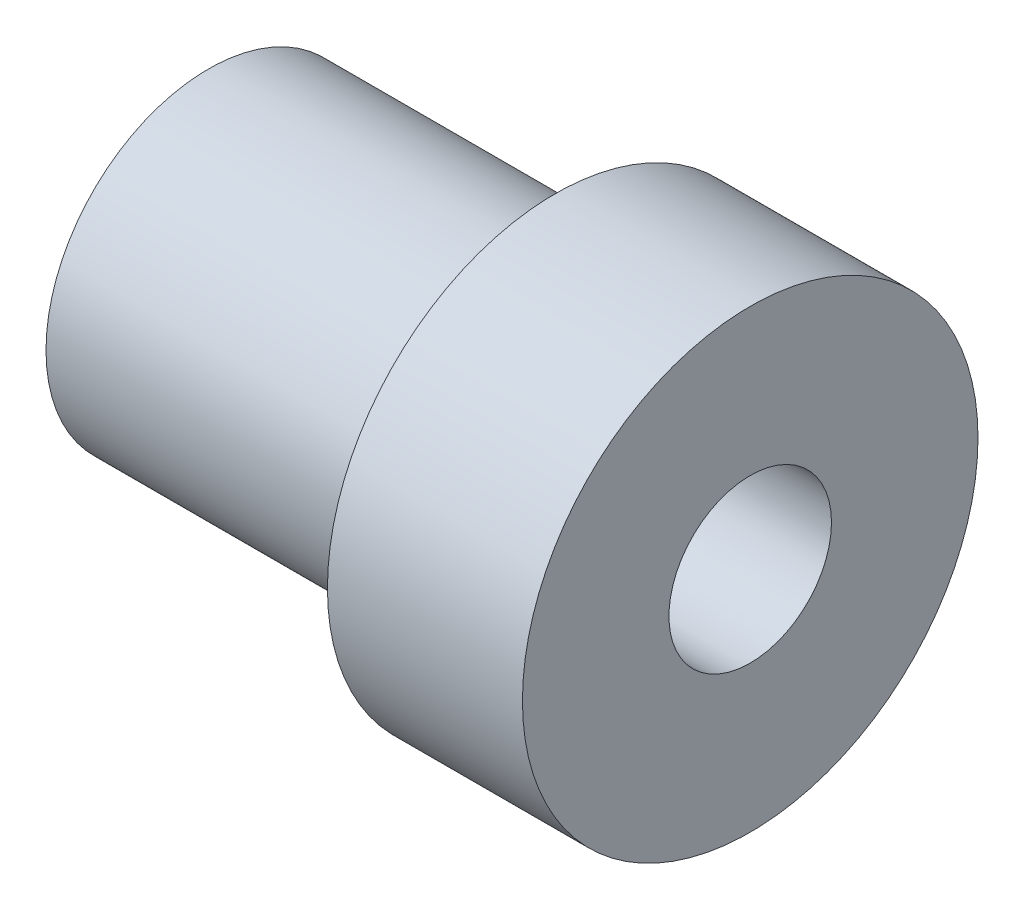
ISO-10303-21;
HEADER;
FILE_DESCRIPTION(('STEP AP214'),'2;1');
FILE_NAME('part.step','',(''),(''),'','','');
FILE_SCHEMA(('AUTOMOTIVE_DESIGN { 1 0 10303 214 1 1 1 1 }'));
ENDSEC;
DATA;
#1=APPLICATION_CONTEXT('core data for automotive mechanical design processes');
#2=APPLICATION_PROTOCOL_DEFINITION('international standard','automotive_design',2000,#1);
#3=PRODUCT_CONTEXT('',#1,'mechanical');
#4=PRODUCT('Part','Part','',(#3));
#5=PRODUCT_RELATED_PRODUCT_CATEGORY('part','',(#4));
#6=PRODUCT_DEFINITION_FORMATION('','',#4);
#7=PRODUCT_DEFINITION_CONTEXT('part definition',#1,'design');
#8=PRODUCT_DEFINITION('design','',#6,#7);
#9=PRODUCT_DEFINITION_SHAPE('','',#8);
#10=(LENGTH_UNIT() NAMED_UNIT(*) SI_UNIT(.MILLI.,.METRE.));
#11=(NAMED_UNIT(*) PLANE_ANGLE_UNIT() SI_UNIT($,.RADIAN.));
#12=(NAMED_UNIT(*) SI_UNIT($,.STERADIAN.) SOLID_ANGLE_UNIT());
#13=UNCERTAINTY_MEASURE_WITH_UNIT(LENGTH_MEASURE(1.E-05),#10,'distance_accuracy_value','');
#14=(GEOMETRIC_REPRESENTATION_CONTEXT(3) GLOBAL_UNCERTAINTY_ASSIGNED_CONTEXT((#13)) GLOBAL_UNIT_ASSIGNED_CONTEXT((#10,
#11,#12)) REPRESENTATION_CONTEXT('',''));
#15=CARTESIAN_POINT('',(0.,0.,0.));
#16=DIRECTION('',(0.,0.,1.));
#17=DIRECTION('',(1.,0.,0.));
#18=AXIS2_PLACEMENT_3D('',#15,#16,#17);
#19=CARTESIAN_POINT('',(8.46666666666667,0.,0.));
#20=DIRECTION('',(-1.,0.,0.));
#21=DIRECTION('',(0.,0.,1.));
#22=AXIS2_PLACEMENT_3D('',#19,#20,#21);
#23=CYLINDRICAL_SURFACE('',#22,3.96875);
#24=CARTESIAN_POINT('',(8.46666666666667,0.,0.));
#25=DIRECTION('',(1.,0.,0.));
#26=DIRECTION('',(0.,0.,-1.));
#27=AXIS2_PLACEMENT_3D('',#24,#25,#26);
#28=CIRCLE('',#27,3.96875);
#29=CARTESIAN_POINT('',(8.46666666666667,0.,-3.96875));
#30=VERTEX_POINT('',#29);
#31=EDGE_CURVE('E10',#30,#30,#28,.T.);
#32=ORIENTED_EDGE('',*,*,#31,.F.);
#33=EDGE_LOOP('',(#32));
#34=FACE_BOUND('',#33,.T.);
#35=CARTESIAN_POINT('',(0.,0.,0.));
#36=DIRECTION('',(1.,0.,0.));
#37=DIRECTION('',(0.,0.,-1.));
#38=AXIS2_PLACEMENT_3D('',#35,#36,#37);
#39=CIRCLE('',#38,3.96875);
#40=CARTESIAN_POINT('',(0.,0.,-3.96875));
#41=VERTEX_POINT('',#40);
#42=EDGE_CURVE('E34',#41,#41,#39,.T.);
#43=ORIENTED_EDGE('',*,*,#42,.T.);
#44=EDGE_LOOP('',(#43));
#45=FACE_BOUND('',#44,.T.);
#46=ADVANCED_FACE('F31',(#34,#45),#23,.T.);
#47=CARTESIAN_POINT('',(0.,0.,0.));
#48=DIRECTION('',(1.,0.,0.));
#49=DIRECTION('',(0.,0.,-1.));
#50=AXIS2_PLACEMENT_3D('',#47,#48,#49);
#51=PLANE('',#50);
#52=CARTESIAN_POINT('',(0.,0.,0.));
#53=DIRECTION('',(1.,0.,0.));
#54=DIRECTION('',(0.,0.,-1.));
#55=AXIS2_PLACEMENT_3D('',#52,#53,#54);
#56=CIRCLE('',#55,1.98437499999999);
#57=CARTESIAN_POINT('',(0.,0.,-1.98437499999999));
#58=VERTEX_POINT('',#57);
#59=EDGE_CURVE('E46',#58,#58,#56,.T.);
#60=ORIENTED_EDGE('',*,*,#59,.T.);
#61=EDGE_LOOP('',(#60));
#62=FACE_BOUND('',#61,.T.);
#63=ORIENTED_EDGE('',*,*,#42,.F.);
#64=EDGE_LOOP('',(#63));
#65=FACE_BOUND('',#64,.T.);
#66=ADVANCED_FACE('F72',(#62,#65),#51,.F.);
#67=CARTESIAN_POINT('',(8.46666666666667,0.,0.));
#68=DIRECTION('',(1.,0.,0.));
#69=DIRECTION('',(0.,0.,-1.));
#70=AXIS2_PLACEMENT_3D('',#67,#68,#69);
#71=PLANE('',#70);
#72=CARTESIAN_POINT('',(8.46666666666667,0.,0.));
#73=DIRECTION('',(1.,0.,0.));
#74=DIRECTION('',(0.,0.,-1.));
#75=AXIS2_PLACEMENT_3D('',#72,#73,#74);
#76=CIRCLE('',#75,5.5626);
#77=CARTESIAN_POINT('',(8.46666666666666,0.,5.5626));
#78=VERTEX_POINT('',#77);
#79=EDGE_CURVE('E43',#78,#78,#76,.T.);
#80=ORIENTED_EDGE('',*,*,#79,.F.);
#81=EDGE_LOOP('',(#80));
#82=FACE_BOUND('',#81,.T.);
#83=ORIENTED_EDGE('',*,*,#31,.T.);
#84=EDGE_LOOP('',(#83));
#85=FACE_BOUND('',#84,.T.);
#86=ADVANCED_FACE('F67',(#82,#85),#71,.F.);
#87=CARTESIAN_POINT('',(13.2291666666667,0.,0.));
#88=DIRECTION('',(-1.,0.,0.));
#89=DIRECTION('',(0.,0.,1.));
#90=AXIS2_PLACEMENT_3D('',#87,#88,#89);
#91=CYLINDRICAL_SURFACE('',#90,5.5626);
#92=CARTESIAN_POINT('',(13.2291666666667,0.,0.));
#93=DIRECTION('',(1.,0.,0.));
#94=DIRECTION('',(0.,0.,-1.));
#95=AXIS2_PLACEMENT_3D('',#92,#93,#94);
#96=CIRCLE('',#95,5.5626);
#97=CARTESIAN_POINT('',(13.2291666666667,0.,5.5626));
#98=VERTEX_POINT('',#97);
#99=EDGE_CURVE('E41',#98,#98,#96,.T.);
#100=CARTESIAN_POINT('',(13.2291666666667,0.,5.5626));
#101=CARTESIAN_POINT('',(13.1795572916667,0.,5.5626));
#102=CARTESIAN_POINT('',(13.1299479166667,0.,5.5626));
#103=CARTESIAN_POINT('',(13.0307291666667,0.,5.5626));
#104=CARTESIAN_POINT('',(12.9811197916667,0.,5.5626));
#105=CARTESIAN_POINT('',(12.8819010416667,0.,5.5626));
#106=CARTESIAN_POINT('',(12.8322916666667,0.,5.5626));
#107=CARTESIAN_POINT('',(12.7330729166667,0.,5.5626));
#108=CARTESIAN_POINT('',(12.6834635416667,0.,5.5626));
#109=CARTESIAN_POINT('',(12.5842447916667,0.,5.5626));
#110=CARTESIAN_POINT('',(12.5346354166667,0.,5.5626));
#111=CARTESIAN_POINT('',(12.4354166666667,0.,5.5626));
#112=CARTESIAN_POINT('',(12.3858072916667,0.,5.5626));
#113=CARTESIAN_POINT('',(12.2865885416667,0.,5.5626));
#114=CARTESIAN_POINT('',(12.2369791666667,0.,5.5626));
#115=CARTESIAN_POINT('',(12.1377604166667,0.,5.5626));
#116=CARTESIAN_POINT('',(12.0881510416667,0.,5.5626));
#117=CARTESIAN_POINT('',(11.9889322916667,0.,5.5626));
#118=CARTESIAN_POINT('',(11.9393229166667,0.,5.5626));
#119=CARTESIAN_POINT('',(11.8401041666667,0.,5.5626));
#120=CARTESIAN_POINT('',(11.7904947916667,0.,5.5626));
#121=CARTESIAN_POINT('',(11.6912760416667,0.,5.5626));
#122=CARTESIAN_POINT('',(11.6416666666667,0.,5.5626));
#123=CARTESIAN_POINT('',(11.5424479166667,0.,5.5626));
#124=CARTESIAN_POINT('',(11.4928385416667,0.,5.5626));
#125=CARTESIAN_POINT('',(11.3936197916667,0.,5.5626));
#126=CARTESIAN_POINT('',(11.3440104166667,0.,5.5626));
#127=CARTESIAN_POINT('',(11.2447916666667,0.,5.5626));
#128=CARTESIAN_POINT('',(11.1951822916667,0.,5.5626));
#129=CARTESIAN_POINT('',(11.0959635416667,0.,5.5626));
#130=CARTESIAN_POINT('',(11.0463541666667,0.,5.5626));
#131=CARTESIAN_POINT('',(10.9471354166667,0.,5.5626));
#132=CARTESIAN_POINT('',(10.8975260416667,0.,5.5626));
#133=CARTESIAN_POINT('',(10.7983072916667,0.,5.5626));
#134=CARTESIAN_POINT('',(10.7486979166667,0.,5.5626));
#135=CARTESIAN_POINT('',(10.6494791666667,0.,5.5626));
#136=CARTESIAN_POINT('',(10.5998697916667,0.,5.5626));
#137=CARTESIAN_POINT('',(10.5006510416667,0.,5.5626));
#138=CARTESIAN_POINT('',(10.4510416666667,0.,5.5626));
#139=CARTESIAN_POINT('',(10.3518229166667,0.,5.5626));
#140=CARTESIAN_POINT('',(10.3022135416667,0.,5.5626));
#141=CARTESIAN_POINT('',(10.2029947916667,0.,5.5626));
#142=CARTESIAN_POINT('',(10.1533854166667,0.,5.5626));
#143=CARTESIAN_POINT('',(10.0541666666667,0.,5.5626));
#144=CARTESIAN_POINT('',(10.0045572916667,0.,5.5626));
#145=CARTESIAN_POINT('',(9.90533854166666,0.,5.5626));
#146=CARTESIAN_POINT('',(9.85572916666666,0.,5.5626));
#147=CARTESIAN_POINT('',(9.75651041666666,0.,5.5626));
#148=CARTESIAN_POINT('',(9.70690104166667,0.,5.5626));
#149=CARTESIAN_POINT('',(9.60768229166666,0.,5.5626));
#150=CARTESIAN_POINT('',(9.55807291666667,0.,5.5626));
#151=CARTESIAN_POINT('',(9.45885416666666,0.,5.5626));
#152=CARTESIAN_POINT('',(9.40924479166667,0.,5.5626));
#153=CARTESIAN_POINT('',(9.31002604166666,0.,5.5626));
#154=CARTESIAN_POINT('',(9.26041666666666,0.,5.5626));
#155=CARTESIAN_POINT('',(9.16119791666666,0.,5.5626));
#156=CARTESIAN_POINT('',(9.11158854166666,0.,5.5626));
#157=CARTESIAN_POINT('',(9.01236979166666,0.,5.5626));
#158=CARTESIAN_POINT('',(8.96276041666667,0.,5.5626));
#159=CARTESIAN_POINT('',(8.86354166666666,0.,5.5626));
#160=CARTESIAN_POINT('',(8.81393229166667,0.,5.5626));
#161=CARTESIAN_POINT('',(8.71471354166666,0.,5.5626));
#162=CARTESIAN_POINT('',(8.66510416666666,0.,5.5626));
#163=CARTESIAN_POINT('',(8.56588541666666,0.,5.5626));
#164=CARTESIAN_POINT('',(8.51627604166666,0.,5.5626));
#165=CARTESIAN_POINT('',(8.46666666666666,0.,5.5626));
#166=B_SPLINE_CURVE_WITH_KNOTS('',3,(#100,#101,#102,#103,#104,#105,#106,#107,#108,#109,#110,
#111,#112,#113,#114,#115,#116,#117,#118,#119,#120,#121,#122,#123,#124,#125,#126,#127,#128,#129,
#130,#131,#132,#133,#134,#135,#136,#137,#138,#139,#140,#141,#142,#143,#144,#145,#146,#147,#148,
#149,#150,#151,#152,#153,#154,#155,#156,#157,#158,#159,#160,#161,#162,#163,#164,#165),
.UNSPECIFIED.,.F.,.F.,(4,2,2,2,2,2,2,2,2,2,2,2,2,2,2,2,2,2,2,2,2,2,2,2,2,2,2,2,2,2,2,2,4),(0.,
0.148828125,0.29765625,0.446484375,0.5953125,0.744140625,0.892968750000001,1.041796875,1.190625,
1.339453125,1.48828125,1.637109375,1.7859375,1.934765625,2.08359375,2.232421875,2.38125,
2.530078125,2.67890625,2.827734375,2.9765625,3.125390625,3.27421875,3.423046875,3.571875,
3.720703125,3.86953125,4.018359375,4.1671875,4.316015625,4.46484375,4.613671875,4.7625),.UNSPECIFIED.);
#167=EDGE_CURVE('BSEAM61',#98,#78,#166,.T.);
#168=ORIENTED_EDGE('',*,*,#99,.F.);
#169=ORIENTED_EDGE('',*,*,#79,.T.);
#170=ORIENTED_EDGE('',*,*,#167,.T.);
#171=ORIENTED_EDGE('',*,*,#167,.F.);
#172=EDGE_LOOP('',(#168,#170,#169,#171));
#173=FACE_BOUND('',#172,.T.);
#174=ADVANCED_FACE('F61',(#173),#91,.T.);
#175=CARTESIAN_POINT('',(13.2291666666667,0.,0.));
#176=DIRECTION('',(1.,0.,0.));
#177=DIRECTION('',(0.,0.,-1.));
#178=AXIS2_PLACEMENT_3D('',#175,#176,#177);
#179=PLANE('',#178);
#180=CARTESIAN_POINT('',(13.2291666666667,0.,0.));
#181=DIRECTION('',(1.,0.,0.));
#182=DIRECTION('',(0.,0.,-1.));
#183=AXIS2_PLACEMENT_3D('',#180,#181,#182);
#184=CIRCLE('',#183,1.98437499999999);
#185=CARTESIAN_POINT('',(13.2291666666667,0.,-1.98437499999999));
#186=VERTEX_POINT('',#185);
#187=EDGE_CURVE('E51',#186,#186,#184,.T.);
#188=ORIENTED_EDGE('',*,*,#187,.F.);
#189=EDGE_LOOP('',(#188));
#190=FACE_BOUND('',#189,.T.);
#191=ORIENTED_EDGE('',*,*,#99,.T.);
#192=EDGE_LOOP('',(#191));
#193=FACE_BOUND('',#192,.T.);
#194=ADVANCED_FACE('F58',(#190,#193),#179,.T.);
#195=CARTESIAN_POINT('',(13.2291666666667,0.,0.));
#196=DIRECTION('',(1.,0.,0.));
#197=DIRECTION('',(0.,0.,-1.));
#198=AXIS2_PLACEMENT_3D('',#195,#196,#197);
#199=CYLINDRICAL_SURFACE('',#198,1.98437499999999);
#200=ORIENTED_EDGE('',*,*,#187,.T.);
#201=EDGE_LOOP('',(#200));
#202=FACE_BOUND('',#201,.T.);
#203=ORIENTED_EDGE('',*,*,#59,.F.);
#204=EDGE_LOOP('',(#203));
#205=FACE_BOUND('',#204,.T.);
#206=ADVANCED_FACE('F55',(#202,#205),#199,.F.);
#207=CLOSED_SHELL('',(#46,#66,#86,#174,#194,#206));
#208=MANIFOLD_SOLID_BREP('B2',#207);
#209=ADVANCED_BREP_SHAPE_REPRESENTATION('',(#18,#208),#14);
#210=SHAPE_DEFINITION_REPRESENTATION(#9,#209);
ENDSEC;
END-ISO-10303-21;
